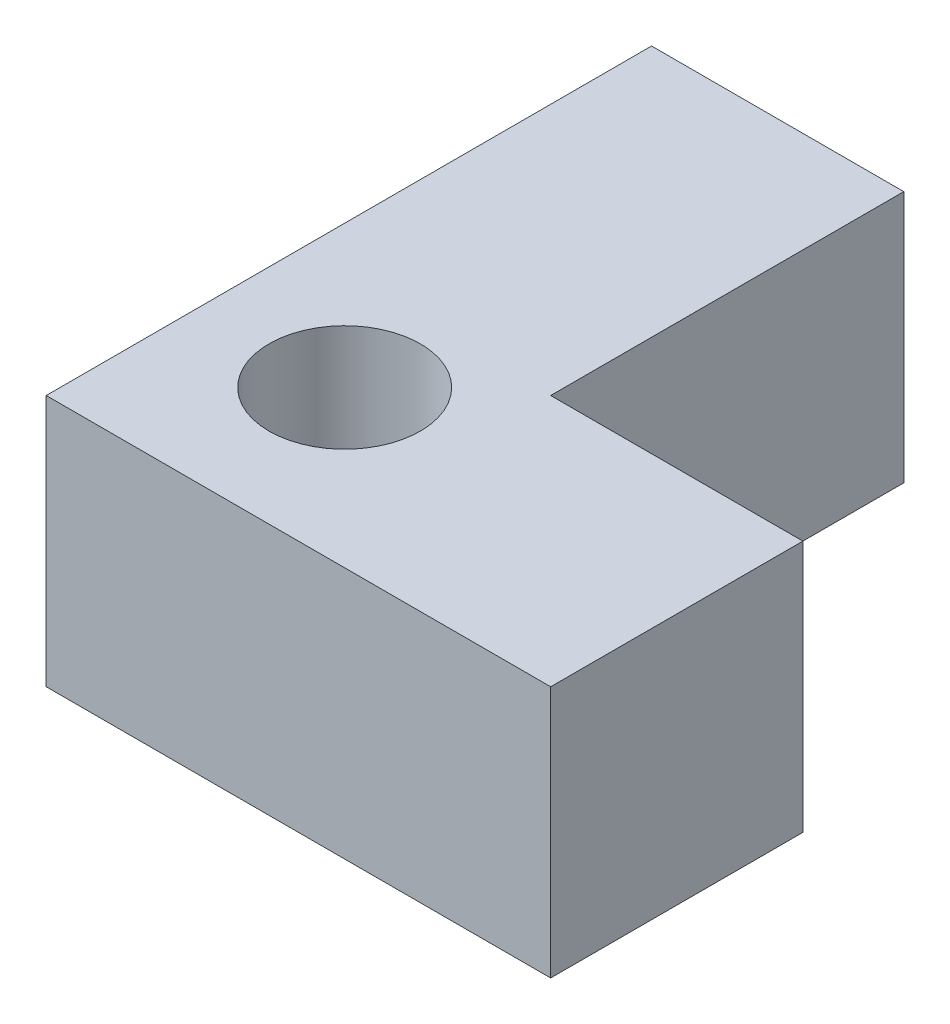
ISO-10303-21;
HEADER;
FILE_DESCRIPTION(('STEP AP214'),'2;1');
FILE_NAME('part.step','',(''),(''),'','','');
FILE_SCHEMA(('AUTOMOTIVE_DESIGN { 1 0 10303 214 1 1 1 1 }'));
ENDSEC;
DATA;
#1=APPLICATION_CONTEXT('core data for automotive mechanical design processes');
#2=APPLICATION_PROTOCOL_DEFINITION('international standard','automotive_design',2000,#1);
#3=PRODUCT_CONTEXT('',#1,'mechanical');
#4=PRODUCT('Part','Part','',(#3));
#5=PRODUCT_RELATED_PRODUCT_CATEGORY('part','',(#4));
#6=PRODUCT_DEFINITION_FORMATION('','',#4);
#7=PRODUCT_DEFINITION_CONTEXT('part definition',#1,'design');
#8=PRODUCT_DEFINITION('design','',#6,#7);
#9=PRODUCT_DEFINITION_SHAPE('','',#8);
#10=(LENGTH_UNIT() NAMED_UNIT(*) SI_UNIT(.MILLI.,.METRE.));
#11=(NAMED_UNIT(*) PLANE_ANGLE_UNIT() SI_UNIT($,.RADIAN.));
#12=(NAMED_UNIT(*) SI_UNIT($,.STERADIAN.) SOLID_ANGLE_UNIT());
#13=UNCERTAINTY_MEASURE_WITH_UNIT(LENGTH_MEASURE(1.E-05),#10,'distance_accuracy_value','');
#14=(GEOMETRIC_REPRESENTATION_CONTEXT(3) GLOBAL_UNCERTAINTY_ASSIGNED_CONTEXT((#13)) GLOBAL_UNIT_ASSIGNED_CONTEXT((#10,
#11,#12)) REPRESENTATION_CONTEXT('',''));
#15=CARTESIAN_POINT('',(0.,0.,0.));
#16=DIRECTION('',(0.,0.,1.));
#17=DIRECTION('',(1.,0.,0.));
#18=AXIS2_PLACEMENT_3D('',#15,#16,#17);
#19=CARTESIAN_POINT('',(-38.9145315278075,12.7,-22.6156405416577));
#20=DIRECTION('',(0.,0.,1.));
#21=DIRECTION('',(1.,0.,0.));
#22=AXIS2_PLACEMENT_3D('',#19,#20,#21);
#23=PLANE('',#22);
#24=DIRECTION('',(-1.,0.,0.));
#25=VECTOR('',#24,1.);
#26=CARTESIAN_POINT('',(-38.9145315278075,0.,-22.6156405416577));
#27=LINE('',#26,#25);
#28=CARTESIAN_POINT('',(-26.2145315278075,0.,-22.6156405416577));
#29=VERTEX_POINT('',#28);
#30=CARTESIAN_POINT('',(-38.9145315278075,0.,-22.6156405416577));
#31=VERTEX_POINT('',#30);
#32=EDGE_CURVE('E130',#29,#31,#27,.T.);
#33=ORIENTED_EDGE('',*,*,#32,.T.);
#34=DIRECTION('',(0.,-1.,0.));
#35=VECTOR('',#34,1.);
#36=CARTESIAN_POINT('',(-38.9145315278075,12.7,-22.6156405416577));
#37=LINE('',#36,#35);
#38=CARTESIAN_POINT('',(-38.9145315278075,12.7,-22.6156405416577));
#39=VERTEX_POINT('',#38);
#40=EDGE_CURVE('E13',#39,#31,#37,.T.);
#41=ORIENTED_EDGE('',*,*,#40,.F.);
#42=DIRECTION('',(-1.,0.,0.));
#43=VECTOR('',#42,1.);
#44=CARTESIAN_POINT('',(-38.9145315278075,12.7,-22.6156405416577));
#45=LINE('',#44,#43);
#46=CARTESIAN_POINT('',(-26.2145315278075,12.7,-22.6156405416577));
#47=VERTEX_POINT('',#46);
#48=EDGE_CURVE('E141',#47,#39,#45,.T.);
#49=ORIENTED_EDGE('',*,*,#48,.F.);
#50=DIRECTION('',(0.,-1.,0.));
#51=VECTOR('',#50,1.);
#52=CARTESIAN_POINT('',(-26.2145315278075,12.7,-22.6156405416577));
#53=LINE('',#52,#51);
#54=EDGE_CURVE('E126',#47,#29,#53,.T.);
#55=ORIENTED_EDGE('',*,*,#54,.T.);
#56=EDGE_LOOP('',(#33,#41,#49,#55));
#57=FACE_BOUND('',#56,.T.);
#58=ADVANCED_FACE('F46',(#57),#23,.F.);
#59=CARTESIAN_POINT('',(-38.9145315278075,12.7,-22.6156405416577));
#60=DIRECTION('',(1.,0.,0.));
#61=DIRECTION('',(0.,0.,-1.));
#62=AXIS2_PLACEMENT_3D('',#59,#60,#61);
#63=PLANE('',#62);
#64=DIRECTION('',(0.,0.,1.));
#65=VECTOR('',#64,1.);
#66=CARTESIAN_POINT('',(-38.9145315278075,0.,-22.6156405416577));
#67=LINE('',#66,#65);
#68=CARTESIAN_POINT('',(-38.9145315278075,0.,7.86435945834225));
#69=VERTEX_POINT('',#68);
#70=EDGE_CURVE('E133',#31,#69,#67,.T.);
#71=ORIENTED_EDGE('',*,*,#70,.T.);
#72=DIRECTION('',(0.,-1.,0.));
#73=VECTOR('',#72,1.);
#74=CARTESIAN_POINT('',(-38.9145315278075,12.7,7.86435945834225));
#75=LINE('',#74,#73);
#76=CARTESIAN_POINT('',(-38.9145315278075,12.7,7.86435945834225));
#77=VERTEX_POINT('',#76);
#78=EDGE_CURVE('E54',#77,#69,#75,.T.);
#79=ORIENTED_EDGE('',*,*,#78,.F.);
#80=DIRECTION('',(0.,0.,1.));
#81=VECTOR('',#80,1.);
#82=CARTESIAN_POINT('',(-38.9145315278075,12.7,-22.6156405416577));
#83=LINE('',#82,#81);
#84=EDGE_CURVE('E99',#39,#77,#83,.T.);
#85=ORIENTED_EDGE('',*,*,#84,.F.);
#86=ORIENTED_EDGE('',*,*,#40,.T.);
#87=EDGE_LOOP('',(#71,#79,#85,#86));
#88=FACE_BOUND('',#87,.T.);
#89=ADVANCED_FACE('F166',(#88),#63,.F.);
#90=CARTESIAN_POINT('',(-13.5145315278075,12.7,7.86435945834225));
#91=DIRECTION('',(0.,0.,-1.));
#92=DIRECTION('',(-1.,0.,0.));
#93=AXIS2_PLACEMENT_3D('',#90,#91,#92);
#94=PLANE('',#93);
#95=DIRECTION('',(1.,0.,0.));
#96=VECTOR('',#95,1.);
#97=CARTESIAN_POINT('',(-13.5145315278075,0.,7.86435945834225));
#98=LINE('',#97,#96);
#99=CARTESIAN_POINT('',(-13.5145315278075,0.,7.86435945834225));
#100=VERTEX_POINT('',#99);
#101=EDGE_CURVE('E136',#69,#100,#98,.T.);
#102=ORIENTED_EDGE('',*,*,#101,.T.);
#103=DIRECTION('',(0.,-1.,0.));
#104=VECTOR('',#103,1.);
#105=CARTESIAN_POINT('',(-13.5145315278075,12.7,7.86435945834225));
#106=LINE('',#105,#104);
#107=CARTESIAN_POINT('',(-13.5145315278075,12.7,7.86435945834225));
#108=VERTEX_POINT('',#107);
#109=EDGE_CURVE('E121',#108,#100,#106,.T.);
#110=ORIENTED_EDGE('',*,*,#109,.F.);
#111=DIRECTION('',(1.,0.,0.));
#112=VECTOR('',#111,1.);
#113=CARTESIAN_POINT('',(-13.5145315278075,12.7,7.86435945834225));
#114=LINE('',#113,#112);
#115=EDGE_CURVE('E112',#77,#108,#114,.T.);
#116=ORIENTED_EDGE('',*,*,#115,.F.);
#117=ORIENTED_EDGE('',*,*,#78,.T.);
#118=EDGE_LOOP('',(#102,#110,#116,#117));
#119=FACE_BOUND('',#118,.T.);
#120=ADVANCED_FACE('F147',(#119),#94,.F.);
#121=CARTESIAN_POINT('',(-13.5145315278075,12.7,-4.83564054165775));
#122=DIRECTION('',(-1.,0.,0.));
#123=DIRECTION('',(0.,0.,1.));
#124=AXIS2_PLACEMENT_3D('',#121,#122,#123);
#125=PLANE('',#124);
#126=DIRECTION('',(0.,0.,-1.));
#127=VECTOR('',#126,1.);
#128=CARTESIAN_POINT('',(-13.5145315278075,0.,-4.83564054165775));
#129=LINE('',#128,#127);
#130=CARTESIAN_POINT('',(-13.5145315278075,0.,-4.83564054165775));
#131=VERTEX_POINT('',#130);
#132=EDGE_CURVE('E120',#100,#131,#129,.T.);
#133=ORIENTED_EDGE('',*,*,#132,.T.);
#134=DIRECTION('',(0.,-1.,0.));
#135=VECTOR('',#134,1.);
#136=CARTESIAN_POINT('',(-13.5145315278075,12.7,-4.83564054165775));
#137=LINE('',#136,#135);
#138=CARTESIAN_POINT('',(-13.5145315278075,12.7,-4.83564054165775));
#139=VERTEX_POINT('',#138);
#140=EDGE_CURVE('E117',#139,#131,#137,.T.);
#141=ORIENTED_EDGE('',*,*,#140,.F.);
#142=DIRECTION('',(0.,0.,-1.));
#143=VECTOR('',#142,1.);
#144=CARTESIAN_POINT('',(-13.5145315278075,12.7,-4.83564054165775));
#145=LINE('',#144,#143);
#146=EDGE_CURVE('E106',#108,#139,#145,.T.);
#147=ORIENTED_EDGE('',*,*,#146,.F.);
#148=ORIENTED_EDGE('',*,*,#109,.T.);
#149=EDGE_LOOP('',(#133,#141,#147,#148));
#150=FACE_BOUND('',#149,.T.);
#151=ADVANCED_FACE('F118',(#150),#125,.F.);
#152=CARTESIAN_POINT('',(-26.2145315278075,12.7,-4.83564054165775));
#153=DIRECTION('',(0.,0.,1.));
#154=DIRECTION('',(1.,0.,0.));
#155=AXIS2_PLACEMENT_3D('',#152,#153,#154);
#156=PLANE('',#155);
#157=DIRECTION('',(-1.,0.,0.));
#158=VECTOR('',#157,1.);
#159=CARTESIAN_POINT('',(-26.2145315278075,0.,-4.83564054165775));
#160=LINE('',#159,#158);
#161=CARTESIAN_POINT('',(-26.2145315278075,0.,-4.83564054165775));
#162=VERTEX_POINT('',#161);
#163=EDGE_CURVE('E85',#131,#162,#160,.T.);
#164=ORIENTED_EDGE('',*,*,#163,.T.);
#165=DIRECTION('',(0.,-1.,0.));
#166=VECTOR('',#165,1.);
#167=CARTESIAN_POINT('',(-26.2145315278075,12.7,-4.83564054165775));
#168=LINE('',#167,#166);
#169=CARTESIAN_POINT('',(-26.2145315278075,12.7,-4.83564054165775));
#170=VERTEX_POINT('',#169);
#171=EDGE_CURVE('E122',#170,#162,#168,.T.);
#172=ORIENTED_EDGE('',*,*,#171,.F.);
#173=DIRECTION('',(-1.,0.,0.));
#174=VECTOR('',#173,1.);
#175=CARTESIAN_POINT('',(-26.2145315278075,12.7,-4.83564054165775));
#176=LINE('',#175,#174);
#177=EDGE_CURVE('E110',#139,#170,#176,.T.);
#178=ORIENTED_EDGE('',*,*,#177,.F.);
#179=ORIENTED_EDGE('',*,*,#140,.T.);
#180=EDGE_LOOP('',(#164,#172,#178,#179));
#181=FACE_BOUND('',#180,.T.);
#182=ADVANCED_FACE('F124',(#181),#156,.F.);
#183=CARTESIAN_POINT('',(-26.2145315278075,12.7,-22.6156405416577));
#184=DIRECTION('',(-1.,0.,0.));
#185=DIRECTION('',(0.,0.,1.));
#186=AXIS2_PLACEMENT_3D('',#183,#184,#185);
#187=PLANE('',#186);
#188=DIRECTION('',(0.,0.,-1.));
#189=VECTOR('',#188,1.);
#190=CARTESIAN_POINT('',(-26.2145315278075,0.,-22.6156405416577));
#191=LINE('',#190,#189);
#192=EDGE_CURVE('E91',#162,#29,#191,.T.);
#193=ORIENTED_EDGE('',*,*,#192,.T.);
#194=ORIENTED_EDGE('',*,*,#54,.F.);
#195=DIRECTION('',(0.,0.,-1.));
#196=VECTOR('',#195,1.);
#197=CARTESIAN_POINT('',(-26.2145315278075,12.7,-22.6156405416577));
#198=LINE('',#197,#196);
#199=EDGE_CURVE('E62',#170,#47,#198,.T.);
#200=ORIENTED_EDGE('',*,*,#199,.F.);
#201=ORIENTED_EDGE('',*,*,#171,.T.);
#202=EDGE_LOOP('',(#193,#194,#200,#201));
#203=FACE_BOUND('',#202,.T.);
#204=ADVANCED_FACE('F154',(#203),#187,.F.);
#205=CARTESIAN_POINT('',(0.,12.7,0.));
#206=DIRECTION('',(0.,-1.,0.));
#207=DIRECTION('',(0.,0.,-1.));
#208=AXIS2_PLACEMENT_3D('',#205,#206,#207);
#209=PLANE('',#208);
#210=CARTESIAN_POINT('',(-31.75,12.7,0.));
#211=DIRECTION('',(0.,1.,0.));
#212=DIRECTION('',(0.,0.,1.));
#213=AXIS2_PLACEMENT_3D('',#210,#211,#212);
#214=CIRCLE('',#213,3.81);
#215=CARTESIAN_POINT('',(-31.75,12.7,3.81));
#216=VERTEX_POINT('',#215);
#217=EDGE_CURVE('E221',#216,#216,#214,.T.);
#218=ORIENTED_EDGE('',*,*,#217,.F.);
#219=EDGE_LOOP('',(#218));
#220=FACE_BOUND('',#219,.T.);
#221=ORIENTED_EDGE('',*,*,#48,.T.);
#222=ORIENTED_EDGE('',*,*,#84,.T.);
#223=ORIENTED_EDGE('',*,*,#115,.T.);
#224=ORIENTED_EDGE('',*,*,#146,.T.);
#225=ORIENTED_EDGE('',*,*,#177,.T.);
#226=ORIENTED_EDGE('',*,*,#199,.T.);
#227=EDGE_LOOP('',(#221,#222,#223,#224,#225,#226));
#228=FACE_BOUND('',#227,.T.);
#229=ADVANCED_FACE('F108',(#220,#228),#209,.F.);
#230=CARTESIAN_POINT('',(0.,0.,0.));
#231=DIRECTION('',(0.,-1.,0.));
#232=DIRECTION('',(0.,0.,-1.));
#233=AXIS2_PLACEMENT_3D('',#230,#231,#232);
#234=PLANE('',#233);
#235=CARTESIAN_POINT('',(-31.75,0.,0.));
#236=DIRECTION('',(0.,1.,0.));
#237=DIRECTION('',(0.,0.,1.));
#238=AXIS2_PLACEMENT_3D('',#235,#236,#237);
#239=CIRCLE('',#238,3.81);
#240=CARTESIAN_POINT('',(-31.75,0.,3.81));
#241=VERTEX_POINT('',#240);
#242=EDGE_CURVE('E134',#241,#241,#239,.T.);
#243=ORIENTED_EDGE('',*,*,#242,.T.);
#244=EDGE_LOOP('',(#243));
#245=FACE_BOUND('',#244,.T.);
#246=ORIENTED_EDGE('',*,*,#32,.F.);
#247=ORIENTED_EDGE('',*,*,#192,.F.);
#248=ORIENTED_EDGE('',*,*,#163,.F.);
#249=ORIENTED_EDGE('',*,*,#132,.F.);
#250=ORIENTED_EDGE('',*,*,#101,.F.);
#251=ORIENTED_EDGE('',*,*,#70,.F.);
#252=EDGE_LOOP('',(#246,#247,#248,#249,#250,#251));
#253=FACE_BOUND('',#252,.T.);
#254=ADVANCED_FACE('F150',(#245,#253),#234,.T.);
#255=CARTESIAN_POINT('',(-31.75,0.,0.));
#256=DIRECTION('',(0.,1.,0.));
#257=DIRECTION('',(0.,0.,1.));
#258=AXIS2_PLACEMENT_3D('',#255,#256,#257);
#259=CYLINDRICAL_SURFACE('',#258,3.81);
#260=ORIENTED_EDGE('',*,*,#242,.F.);
#261=EDGE_LOOP('',(#260));
#262=FACE_BOUND('',#261,.T.);
#263=ORIENTED_EDGE('',*,*,#217,.T.);
#264=EDGE_LOOP('',(#263));
#265=FACE_BOUND('',#264,.T.);
#266=ADVANCED_FACE('F203',(#262,#265),#259,.F.);
#267=CLOSED_SHELL('',(#58,#89,#120,#151,#182,#204,#229,#254,#266));
#268=MANIFOLD_SOLID_BREP('B2',#267);
#269=ADVANCED_BREP_SHAPE_REPRESENTATION('',(#18,#268),#14);
#270=SHAPE_DEFINITION_REPRESENTATION(#9,#269);
ENDSEC;
END-ISO-10303-21;
